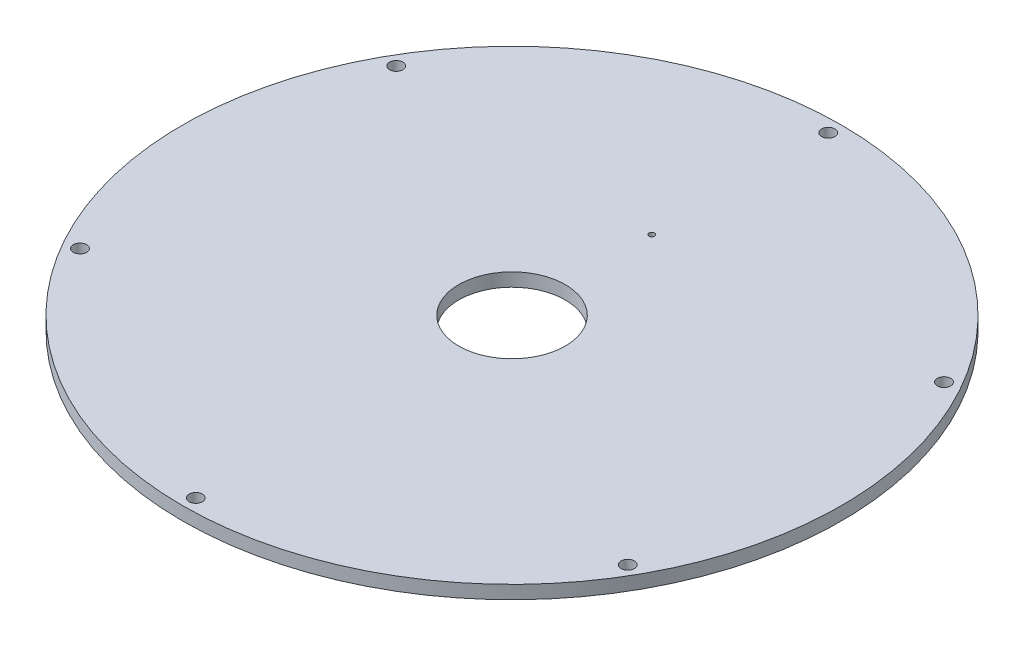
ISO-10303-21;
HEADER;
FILE_DESCRIPTION(('STEP AP214'),'2;1');
FILE_NAME('part.step','',(''),(''),'','','');
FILE_SCHEMA(('AUTOMOTIVE_DESIGN { 1 0 10303 214 1 1 1 1 }'));
ENDSEC;
DATA;
#1=APPLICATION_CONTEXT('core data for automotive mechanical design processes');
#2=APPLICATION_PROTOCOL_DEFINITION('international standard','automotive_design',2000,#1);
#3=PRODUCT_CONTEXT('',#1,'mechanical');
#4=PRODUCT('Part','Part','',(#3));
#5=PRODUCT_RELATED_PRODUCT_CATEGORY('part','',(#4));
#6=PRODUCT_DEFINITION_FORMATION('','',#4);
#7=PRODUCT_DEFINITION_CONTEXT('part definition',#1,'design');
#8=PRODUCT_DEFINITION('design','',#6,#7);
#9=PRODUCT_DEFINITION_SHAPE('','',#8);
#10=(LENGTH_UNIT() NAMED_UNIT(*) SI_UNIT(.MILLI.,.METRE.));
#11=(NAMED_UNIT(*) PLANE_ANGLE_UNIT() SI_UNIT($,.RADIAN.));
#12=(NAMED_UNIT(*) SI_UNIT($,.STERADIAN.) SOLID_ANGLE_UNIT());
#13=UNCERTAINTY_MEASURE_WITH_UNIT(LENGTH_MEASURE(1.E-05),#10,'distance_accuracy_value','');
#14=(GEOMETRIC_REPRESENTATION_CONTEXT(3) GLOBAL_UNCERTAINTY_ASSIGNED_CONTEXT((#13)) GLOBAL_UNIT_ASSIGNED_CONTEXT((#10,
#11,#12)) REPRESENTATION_CONTEXT('',''));
#15=CARTESIAN_POINT('',(0.,0.,0.));
#16=DIRECTION('',(0.,0.,1.));
#17=DIRECTION('',(1.,0.,0.));
#18=AXIS2_PLACEMENT_3D('',#15,#16,#17);
#19=CARTESIAN_POINT('',(0.,2.,0.));
#20=DIRECTION('',(0.,1.,0.));
#21=DIRECTION('',(0.,0.,1.));
#22=AXIS2_PLACEMENT_3D('',#19,#20,#21);
#23=PLANE('',#22);
#24=CARTESIAN_POINT('',(0.,2.,-21.));
#25=DIRECTION('',(0.,1.,0.));
#26=DIRECTION('',(0.,0.,1.));
#27=AXIS2_PLACEMENT_3D('',#24,#25,#26);
#28=CIRCLE('',#27,0.42);
#29=CARTESIAN_POINT('',(0.,2.,-20.58));
#30=VERTEX_POINT('',#29);
#31=EDGE_CURVE('E83',#30,#30,#28,.T.);
#32=ORIENTED_EDGE('',*,*,#31,.F.);
#33=EDGE_LOOP('',(#32));
#34=FACE_BOUND('',#33,.T.);
#35=CARTESIAN_POINT('',(-41.1362066797573,2.,23.750000000002));
#36=DIRECTION('',(0.,1.,0.));
#37=DIRECTION('',(0.,0.,1.));
#38=AXIS2_PLACEMENT_3D('',#35,#36,#37);
#39=CIRCLE('',#38,0.999999999999998);
#40=CARTESIAN_POINT('',(-41.1362066797573,2.,24.750000000002));
#41=VERTEX_POINT('',#40);
#42=EDGE_CURVE('E71',#41,#41,#39,.T.);
#43=ORIENTED_EDGE('',*,*,#42,.F.);
#44=EDGE_LOOP('',(#43));
#45=FACE_BOUND('',#44,.T.);
#46=CARTESIAN_POINT('',(41.1362066797643,2.,23.749999999998));
#47=DIRECTION('',(0.,1.,0.));
#48=DIRECTION('',(0.,0.,1.));
#49=AXIS2_PLACEMENT_3D('',#46,#47,#48);
#50=CIRCLE('',#49,0.999999999999998);
#51=CARTESIAN_POINT('',(41.1362066797643,2.,24.749999999998));
#52=VERTEX_POINT('',#51);
#53=EDGE_CURVE('E59',#52,#52,#50,.T.);
#54=ORIENTED_EDGE('',*,*,#53,.F.);
#55=EDGE_LOOP('',(#54));
#56=FACE_BOUND('',#55,.T.);
#57=CARTESIAN_POINT('',(0.,2.,-47.5));
#58=DIRECTION('',(0.,1.,0.));
#59=DIRECTION('',(0.,0.,1.));
#60=AXIS2_PLACEMENT_3D('',#57,#58,#59);
#61=CIRCLE('',#60,1.);
#62=CARTESIAN_POINT('',(0.,2.,-46.5));
#63=VERTEX_POINT('',#62);
#64=EDGE_CURVE('E47',#63,#63,#61,.T.);
#65=ORIENTED_EDGE('',*,*,#64,.F.);
#66=EDGE_LOOP('',(#65));
#67=FACE_BOUND('',#66,.T.);
#68=CARTESIAN_POINT('',(0.,2.,0.));
#69=DIRECTION('',(0.,1.,0.));
#70=DIRECTION('',(0.,0.,1.));
#71=AXIS2_PLACEMENT_3D('',#68,#69,#70);
#72=CIRCLE('',#71,49.5);
#73=CARTESIAN_POINT('',(0.,2.,49.5));
#74=VERTEX_POINT('',#73);
#75=EDGE_CURVE('E10',#74,#74,#72,.T.);
#76=ORIENTED_EDGE('',*,*,#75,.T.);
#77=EDGE_LOOP('',(#76));
#78=FACE_BOUND('',#77,.T.);
#79=CARTESIAN_POINT('',(0.,2.,0.));
#80=DIRECTION('',(0.,1.,0.));
#81=DIRECTION('',(0.,0.,1.));
#82=AXIS2_PLACEMENT_3D('',#79,#80,#81);
#83=CIRCLE('',#82,8.);
#84=CARTESIAN_POINT('',(0.,2.,8.));
#85=VERTEX_POINT('',#84);
#86=EDGE_CURVE('E42',#85,#85,#83,.T.);
#87=ORIENTED_EDGE('',*,*,#86,.F.);
#88=EDGE_LOOP('',(#87));
#89=FACE_BOUND('',#88,.T.);
#90=CARTESIAN_POINT('',(41.136206679762,2.,-23.750000000002));
#91=DIRECTION('',(0.,1.,0.));
#92=DIRECTION('',(0.,0.,1.));
#93=AXIS2_PLACEMENT_3D('',#90,#91,#92);
#94=CIRCLE('',#93,0.999999999999998);
#95=CARTESIAN_POINT('',(41.136206679762,2.,-22.750000000002));
#96=VERTEX_POINT('',#95);
#97=EDGE_CURVE('E53',#96,#96,#94,.T.);
#98=ORIENTED_EDGE('',*,*,#97,.F.);
#99=EDGE_LOOP('',(#98));
#100=FACE_BOUND('',#99,.T.);
#101=CARTESIAN_POINT('',(4.65191426325269E-12,2.,47.5));
#102=DIRECTION('',(0.,1.,0.));
#103=DIRECTION('',(0.,0.,1.));
#104=AXIS2_PLACEMENT_3D('',#101,#102,#103);
#105=CIRCLE('',#104,1.);
#106=CARTESIAN_POINT('',(4.65191426325269E-12,2.,48.5));
#107=VERTEX_POINT('',#106);
#108=EDGE_CURVE('E65',#107,#107,#105,.T.);
#109=ORIENTED_EDGE('',*,*,#108,.F.);
#110=EDGE_LOOP('',(#109));
#111=FACE_BOUND('',#110,.T.);
#112=CARTESIAN_POINT('',(-41.1362066797597,2.,-23.749999999998));
#113=DIRECTION('',(0.,1.,0.));
#114=DIRECTION('',(0.,0.,1.));
#115=AXIS2_PLACEMENT_3D('',#112,#113,#114);
#116=CIRCLE('',#115,0.999999999999998);
#117=CARTESIAN_POINT('',(-41.1362066797597,2.,-22.749999999998));
#118=VERTEX_POINT('',#117);
#119=EDGE_CURVE('E77',#118,#118,#116,.T.);
#120=ORIENTED_EDGE('',*,*,#119,.F.);
#121=EDGE_LOOP('',(#120));
#122=FACE_BOUND('',#121,.T.);
#123=ADVANCED_FACE('F31',(#34,#45,#56,#67,#78,#89,#100,#111,#122),#23,.T.);
#124=CARTESIAN_POINT('',(0.,0.,0.));
#125=DIRECTION('',(0.,1.,0.));
#126=DIRECTION('',(0.,0.,1.));
#127=AXIS2_PLACEMENT_3D('',#124,#125,#126);
#128=PLANE('',#127);
#129=CARTESIAN_POINT('',(-6.15636257986211,0.,-16.9144671741463));
#130=DIRECTION('',(0.,-1.,0.));
#131=DIRECTION('',(0.,0.,-1.));
#132=AXIS2_PLACEMENT_3D('',#129,#130,#131);
#133=CIRCLE('',#132,1.);
#134=CARTESIAN_POINT('',(-6.15636257986211,0.,-17.9144671741463));
#135=VERTEX_POINT('',#134);
#136=EDGE_CURVE('E104',#135,#135,#133,.T.);
#137=ORIENTED_EDGE('',*,*,#136,.F.);
#138=EDGE_LOOP('',(#137));
#139=FACE_BOUND('',#138,.T.);
#140=CARTESIAN_POINT('',(-6.15636257986199,0.,16.9144671741464));
#141=DIRECTION('',(0.,-1.,0.));
#142=DIRECTION('',(0.,0.,-1.));
#143=AXIS2_PLACEMENT_3D('',#140,#141,#142);
#144=CIRCLE('',#143,1.);
#145=CARTESIAN_POINT('',(-6.15636257986199,0.,15.9144671741464));
#146=VERTEX_POINT('',#145);
#147=EDGE_CURVE('E101',#146,#146,#144,.T.);
#148=ORIENTED_EDGE('',*,*,#147,.F.);
#149=EDGE_LOOP('',(#148));
#150=FACE_BOUND('',#149,.T.);
#151=CARTESIAN_POINT('',(18.,0.,0.));
#152=DIRECTION('',(0.,-1.,0.));
#153=DIRECTION('',(0.,0.,-1.));
#154=AXIS2_PLACEMENT_3D('',#151,#152,#153);
#155=CIRCLE('',#154,1.);
#156=CARTESIAN_POINT('',(18.,0.,-1.));
#157=VERTEX_POINT('',#156);
#158=EDGE_CURVE('E95',#157,#157,#155,.T.);
#159=ORIENTED_EDGE('',*,*,#158,.F.);
#160=EDGE_LOOP('',(#159));
#161=FACE_BOUND('',#160,.T.);
#162=CARTESIAN_POINT('',(0.,0.,-21.));
#163=DIRECTION('',(0.,1.,0.));
#164=DIRECTION('',(0.,0.,1.));
#165=AXIS2_PLACEMENT_3D('',#162,#163,#164);
#166=CIRCLE('',#165,0.42);
#167=CARTESIAN_POINT('',(0.,0.,-20.58));
#168=VERTEX_POINT('',#167);
#169=EDGE_CURVE('E88',#168,#168,#166,.T.);
#170=ORIENTED_EDGE('',*,*,#169,.T.);
#171=EDGE_LOOP('',(#170));
#172=FACE_BOUND('',#171,.T.);
#173=CARTESIAN_POINT('',(0.,0.,0.));
#174=DIRECTION('',(0.,1.,0.));
#175=DIRECTION('',(0.,0.,1.));
#176=AXIS2_PLACEMENT_3D('',#173,#174,#175);
#177=CIRCLE('',#176,49.5);
#178=CARTESIAN_POINT('',(0.,0.,49.5));
#179=VERTEX_POINT('',#178);
#180=EDGE_CURVE('E35',#179,#179,#177,.T.);
#181=ORIENTED_EDGE('',*,*,#180,.F.);
#182=EDGE_LOOP('',(#181));
#183=FACE_BOUND('',#182,.T.);
#184=CARTESIAN_POINT('',(0.,0.,0.));
#185=DIRECTION('',(0.,1.,0.));
#186=DIRECTION('',(0.,0.,1.));
#187=AXIS2_PLACEMENT_3D('',#184,#185,#186);
#188=CIRCLE('',#187,8.);
#189=CARTESIAN_POINT('',(0.,0.,8.));
#190=VERTEX_POINT('',#189);
#191=EDGE_CURVE('E44',#190,#190,#188,.T.);
#192=ORIENTED_EDGE('',*,*,#191,.T.);
#193=EDGE_LOOP('',(#192));
#194=FACE_BOUND('',#193,.T.);
#195=CARTESIAN_POINT('',(0.,0.,-47.5));
#196=DIRECTION('',(0.,1.,0.));
#197=DIRECTION('',(0.,0.,1.));
#198=AXIS2_PLACEMENT_3D('',#195,#196,#197);
#199=CIRCLE('',#198,1.);
#200=CARTESIAN_POINT('',(0.,0.,-46.5));
#201=VERTEX_POINT('',#200);
#202=EDGE_CURVE('E50',#201,#201,#199,.T.);
#203=ORIENTED_EDGE('',*,*,#202,.T.);
#204=EDGE_LOOP('',(#203));
#205=FACE_BOUND('',#204,.T.);
#206=CARTESIAN_POINT('',(41.136206679762,0.,-23.750000000002));
#207=DIRECTION('',(0.,1.,0.));
#208=DIRECTION('',(0.,0.,1.));
#209=AXIS2_PLACEMENT_3D('',#206,#207,#208);
#210=CIRCLE('',#209,0.999999999999998);
#211=CARTESIAN_POINT('',(41.136206679762,0.,-22.750000000002));
#212=VERTEX_POINT('',#211);
#213=EDGE_CURVE('E56',#212,#212,#210,.T.);
#214=ORIENTED_EDGE('',*,*,#213,.T.);
#215=EDGE_LOOP('',(#214));
#216=FACE_BOUND('',#215,.T.);
#217=CARTESIAN_POINT('',(41.1362066797643,0.,23.749999999998));
#218=DIRECTION('',(0.,1.,0.));
#219=DIRECTION('',(0.,0.,1.));
#220=AXIS2_PLACEMENT_3D('',#217,#218,#219);
#221=CIRCLE('',#220,0.999999999999998);
#222=CARTESIAN_POINT('',(41.1362066797643,0.,24.749999999998));
#223=VERTEX_POINT('',#222);
#224=EDGE_CURVE('E62',#223,#223,#221,.T.);
#225=ORIENTED_EDGE('',*,*,#224,.T.);
#226=EDGE_LOOP('',(#225));
#227=FACE_BOUND('',#226,.T.);
#228=CARTESIAN_POINT('',(4.65191426325269E-12,0.,47.5));
#229=DIRECTION('',(0.,1.,0.));
#230=DIRECTION('',(0.,0.,1.));
#231=AXIS2_PLACEMENT_3D('',#228,#229,#230);
#232=CIRCLE('',#231,1.);
#233=CARTESIAN_POINT('',(4.65191426325269E-12,0.,48.5));
#234=VERTEX_POINT('',#233);
#235=EDGE_CURVE('E68',#234,#234,#232,.T.);
#236=ORIENTED_EDGE('',*,*,#235,.T.);
#237=EDGE_LOOP('',(#236));
#238=FACE_BOUND('',#237,.T.);
#239=CARTESIAN_POINT('',(-41.1362066797573,0.,23.750000000002));
#240=DIRECTION('',(0.,1.,0.));
#241=DIRECTION('',(0.,0.,1.));
#242=AXIS2_PLACEMENT_3D('',#239,#240,#241);
#243=CIRCLE('',#242,0.999999999999998);
#244=CARTESIAN_POINT('',(-41.1362066797573,0.,24.750000000002));
#245=VERTEX_POINT('',#244);
#246=EDGE_CURVE('E74',#245,#245,#243,.T.);
#247=ORIENTED_EDGE('',*,*,#246,.T.);
#248=EDGE_LOOP('',(#247));
#249=FACE_BOUND('',#248,.T.);
#250=CARTESIAN_POINT('',(-41.1362066797597,0.,-23.749999999998));
#251=DIRECTION('',(0.,1.,0.));
#252=DIRECTION('',(0.,0.,1.));
#253=AXIS2_PLACEMENT_3D('',#250,#251,#252);
#254=CIRCLE('',#253,0.999999999999998);
#255=CARTESIAN_POINT('',(-41.1362066797597,0.,-22.749999999998));
#256=VERTEX_POINT('',#255);
#257=EDGE_CURVE('E80',#256,#256,#254,.T.);
#258=ORIENTED_EDGE('',*,*,#257,.T.);
#259=EDGE_LOOP('',(#258));
#260=FACE_BOUND('',#259,.T.);
#261=ADVANCED_FACE('F119',(#139,#150,#161,#172,#183,#194,#205,#216,#227,#238,#249,#260),#128,.F.);
#262=CARTESIAN_POINT('',(0.,2.,0.));
#263=DIRECTION('',(0.,-1.,0.));
#264=DIRECTION('',(0.,0.,-1.));
#265=AXIS2_PLACEMENT_3D('',#262,#263,#264);
#266=CYLINDRICAL_SURFACE('',#265,49.5);
#267=ORIENTED_EDGE('',*,*,#75,.F.);
#268=EDGE_LOOP('',(#267));
#269=FACE_BOUND('',#268,.T.);
#270=ORIENTED_EDGE('',*,*,#180,.T.);
#271=EDGE_LOOP('',(#270));
#272=FACE_BOUND('',#271,.T.);
#273=ADVANCED_FACE('F33',(#269,#272),#266,.T.);
#274=CARTESIAN_POINT('',(0.,2.,0.));
#275=DIRECTION('',(0.,-1.,0.));
#276=DIRECTION('',(0.,0.,-1.));
#277=AXIS2_PLACEMENT_3D('',#274,#275,#276);
#278=CYLINDRICAL_SURFACE('',#277,8.);
#279=ORIENTED_EDGE('',*,*,#86,.T.);
#280=EDGE_LOOP('',(#279));
#281=FACE_BOUND('',#280,.T.);
#282=ORIENTED_EDGE('',*,*,#191,.F.);
#283=EDGE_LOOP('',(#282));
#284=FACE_BOUND('',#283,.T.);
#285=ADVANCED_FACE('F168',(#281,#284),#278,.F.);
#286=CARTESIAN_POINT('',(0.,2.,-47.5));
#287=DIRECTION('',(0.,-1.,0.));
#288=DIRECTION('',(0.,0.,-1.));
#289=AXIS2_PLACEMENT_3D('',#286,#287,#288);
#290=CYLINDRICAL_SURFACE('',#289,1.);
#291=ORIENTED_EDGE('',*,*,#64,.T.);
#292=EDGE_LOOP('',(#291));
#293=FACE_BOUND('',#292,.T.);
#294=ORIENTED_EDGE('',*,*,#202,.F.);
#295=EDGE_LOOP('',(#294));
#296=FACE_BOUND('',#295,.T.);
#297=ADVANCED_FACE('F171',(#293,#296),#290,.F.);
#298=CARTESIAN_POINT('',(41.136206679762,2.,-23.750000000002));
#299=DIRECTION('',(0.,-1.,0.));
#300=DIRECTION('',(0.,0.,-1.));
#301=AXIS2_PLACEMENT_3D('',#298,#299,#300);
#302=CYLINDRICAL_SURFACE('',#301,0.999999999999998);
#303=ORIENTED_EDGE('',*,*,#97,.T.);
#304=EDGE_LOOP('',(#303));
#305=FACE_BOUND('',#304,.T.);
#306=ORIENTED_EDGE('',*,*,#213,.F.);
#307=EDGE_LOOP('',(#306));
#308=FACE_BOUND('',#307,.T.);
#309=ADVANCED_FACE('F175',(#305,#308),#302,.F.);
#310=CARTESIAN_POINT('',(41.1362066797643,2.,23.749999999998));
#311=DIRECTION('',(0.,-1.,0.));
#312=DIRECTION('',(0.,0.,-1.));
#313=AXIS2_PLACEMENT_3D('',#310,#311,#312);
#314=CYLINDRICAL_SURFACE('',#313,0.999999999999998);
#315=ORIENTED_EDGE('',*,*,#53,.T.);
#316=EDGE_LOOP('',(#315));
#317=FACE_BOUND('',#316,.T.);
#318=ORIENTED_EDGE('',*,*,#224,.F.);
#319=EDGE_LOOP('',(#318));
#320=FACE_BOUND('',#319,.T.);
#321=ADVANCED_FACE('F179',(#317,#320),#314,.F.);
#322=CARTESIAN_POINT('',(4.65191426325269E-12,2.,47.5));
#323=DIRECTION('',(0.,-1.,0.));
#324=DIRECTION('',(0.,0.,-1.));
#325=AXIS2_PLACEMENT_3D('',#322,#323,#324);
#326=CYLINDRICAL_SURFACE('',#325,1.);
#327=ORIENTED_EDGE('',*,*,#108,.T.);
#328=EDGE_LOOP('',(#327));
#329=FACE_BOUND('',#328,.T.);
#330=ORIENTED_EDGE('',*,*,#235,.F.);
#331=EDGE_LOOP('',(#330));
#332=FACE_BOUND('',#331,.T.);
#333=ADVANCED_FACE('F157',(#329,#332),#326,.F.);
#334=CARTESIAN_POINT('',(-41.1362066797573,2.,23.750000000002));
#335=DIRECTION('',(0.,-1.,0.));
#336=DIRECTION('',(0.,0.,-1.));
#337=AXIS2_PLACEMENT_3D('',#334,#335,#336);
#338=CYLINDRICAL_SURFACE('',#337,0.999999999999998);
#339=ORIENTED_EDGE('',*,*,#42,.T.);
#340=EDGE_LOOP('',(#339));
#341=FACE_BOUND('',#340,.T.);
#342=ORIENTED_EDGE('',*,*,#246,.F.);
#343=EDGE_LOOP('',(#342));
#344=FACE_BOUND('',#343,.T.);
#345=ADVANCED_FACE('F147',(#341,#344),#338,.F.);
#346=CARTESIAN_POINT('',(-41.1362066797597,2.,-23.749999999998));
#347=DIRECTION('',(0.,-1.,0.));
#348=DIRECTION('',(0.,0.,-1.));
#349=AXIS2_PLACEMENT_3D('',#346,#347,#348);
#350=CYLINDRICAL_SURFACE('',#349,0.999999999999998);
#351=ORIENTED_EDGE('',*,*,#119,.T.);
#352=EDGE_LOOP('',(#351));
#353=FACE_BOUND('',#352,.T.);
#354=ORIENTED_EDGE('',*,*,#257,.F.);
#355=EDGE_LOOP('',(#354));
#356=FACE_BOUND('',#355,.T.);
#357=ADVANCED_FACE('F144',(#353,#356),#350,.F.);
#358=CARTESIAN_POINT('',(0.,0.,-21.));
#359=DIRECTION('',(0.,1.,0.));
#360=DIRECTION('',(0.,0.,1.));
#361=AXIS2_PLACEMENT_3D('',#358,#359,#360);
#362=CYLINDRICAL_SURFACE('',#361,0.42);
#363=ORIENTED_EDGE('',*,*,#31,.T.);
#364=EDGE_LOOP('',(#363));
#365=FACE_BOUND('',#364,.T.);
#366=ORIENTED_EDGE('',*,*,#169,.F.);
#367=EDGE_LOOP('',(#366));
#368=FACE_BOUND('',#367,.T.);
#369=ADVANCED_FACE('F146',(#365,#368),#362,.F.);
#370=CARTESIAN_POINT('',(18.,1.,0.));
#371=DIRECTION('',(0.,-1.,0.));
#372=DIRECTION('',(0.,0.,-1.));
#373=AXIS2_PLACEMENT_3D('',#370,#371,#372);
#374=CYLINDRICAL_SURFACE('',#373,1.);
#375=CARTESIAN_POINT('',(18.,1.,0.));
#376=DIRECTION('',(0.,-1.,0.));
#377=DIRECTION('',(0.,0.,-1.));
#378=AXIS2_PLACEMENT_3D('',#375,#376,#377);
#379=CIRCLE('',#378,1.);
#380=CARTESIAN_POINT('',(18.,1.,-1.));
#381=VERTEX_POINT('',#380);
#382=EDGE_CURVE('E92',#381,#381,#379,.T.);
#383=ORIENTED_EDGE('',*,*,#382,.F.);
#384=EDGE_LOOP('',(#383));
#385=FACE_BOUND('',#384,.T.);
#386=ORIENTED_EDGE('',*,*,#158,.T.);
#387=EDGE_LOOP('',(#386));
#388=FACE_BOUND('',#387,.T.);
#389=ADVANCED_FACE('F154',(#385,#388),#374,.F.);
#390=CARTESIAN_POINT('',(18.,1.,0.));
#391=DIRECTION('',(0.,-1.,0.));
#392=DIRECTION('',(0.,0.,-1.));
#393=AXIS2_PLACEMENT_3D('',#390,#391,#392);
#394=PLANE('',#393);
#395=ORIENTED_EDGE('',*,*,#382,.T.);
#396=EDGE_LOOP('',(#395));
#397=FACE_BOUND('',#396,.T.);
#398=ADVANCED_FACE('F230',(#397),#394,.T.);
#399=CARTESIAN_POINT('',(-6.15636257986199,1.,16.9144671741464));
#400=DIRECTION('',(0.,-1.,0.));
#401=DIRECTION('',(0.,0.,-1.));
#402=AXIS2_PLACEMENT_3D('',#399,#400,#401);
#403=CYLINDRICAL_SURFACE('',#402,1.);
#404=CARTESIAN_POINT('',(-6.15636257986199,1.,16.9144671741464));
#405=DIRECTION('',(0.,-1.,0.));
#406=DIRECTION('',(0.,0.,-1.));
#407=AXIS2_PLACEMENT_3D('',#404,#405,#406);
#408=CIRCLE('',#407,1.);
#409=CARTESIAN_POINT('',(-6.15636257986199,1.,15.9144671741464));
#410=VERTEX_POINT('',#409);
#411=EDGE_CURVE('E98',#410,#410,#408,.T.);
#412=ORIENTED_EDGE('',*,*,#411,.F.);
#413=EDGE_LOOP('',(#412));
#414=FACE_BOUND('',#413,.T.);
#415=ORIENTED_EDGE('',*,*,#147,.T.);
#416=EDGE_LOOP('',(#415));
#417=FACE_BOUND('',#416,.T.);
#418=ADVANCED_FACE('F240',(#414,#417),#403,.F.);
#419=CARTESIAN_POINT('',(-6.15636257986199,1.,16.9144671741464));
#420=DIRECTION('',(0.,-1.,0.));
#421=DIRECTION('',(0.,0.,-1.));
#422=AXIS2_PLACEMENT_3D('',#419,#420,#421);
#423=PLANE('',#422);
#424=ORIENTED_EDGE('',*,*,#411,.T.);
#425=EDGE_LOOP('',(#424));
#426=FACE_BOUND('',#425,.T.);
#427=ADVANCED_FACE('F115',(#426),#423,.T.);
#428=CARTESIAN_POINT('',(-6.15636257986211,1.,-16.9144671741463));
#429=DIRECTION('',(0.,-1.,0.));
#430=DIRECTION('',(0.,0.,-1.));
#431=AXIS2_PLACEMENT_3D('',#428,#429,#430);
#432=CYLINDRICAL_SURFACE('',#431,1.);
#433=CARTESIAN_POINT('',(-6.15636257986211,1.,-16.9144671741463));
#434=DIRECTION('',(0.,-1.,0.));
#435=DIRECTION('',(0.,0.,-1.));
#436=AXIS2_PLACEMENT_3D('',#433,#434,#435);
#437=CIRCLE('',#436,1.);
#438=CARTESIAN_POINT('',(-6.15636257986211,1.,-17.9144671741463));
#439=VERTEX_POINT('',#438);
#440=EDGE_CURVE('E91',#439,#439,#437,.T.);
#441=ORIENTED_EDGE('',*,*,#440,.F.);
#442=EDGE_LOOP('',(#441));
#443=FACE_BOUND('',#442,.T.);
#444=ORIENTED_EDGE('',*,*,#136,.T.);
#445=EDGE_LOOP('',(#444));
#446=FACE_BOUND('',#445,.T.);
#447=ADVANCED_FACE('F112',(#443,#446),#432,.F.);
#448=CARTESIAN_POINT('',(0.,1.,0.));
#449=DIRECTION('',(0.,-1.,0.));
#450=DIRECTION('',(0.,0.,-1.));
#451=AXIS2_PLACEMENT_3D('',#448,#449,#450);
#452=PLANE('',#451);
#453=ORIENTED_EDGE('',*,*,#440,.T.);
#454=EDGE_LOOP('',(#453));
#455=FACE_BOUND('',#454,.T.);
#456=ADVANCED_FACE('F110',(#455),#452,.T.);
#457=CLOSED_SHELL('',(#123,#261,#273,#285,#297,#309,#321,#333,#345,#357,#369,#389,#398,#418,
#427,#447,#456));
#458=MANIFOLD_SOLID_BREP('B2',#457);
#459=ADVANCED_BREP_SHAPE_REPRESENTATION('',(#18,#458),#14);
#460=SHAPE_DEFINITION_REPRESENTATION(#9,#459);
ENDSEC;
END-ISO-10303-21;
